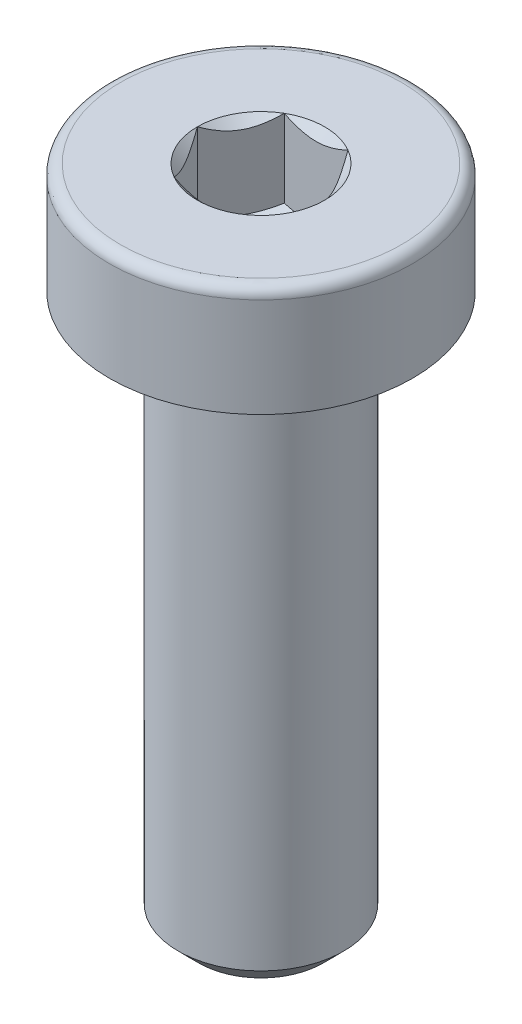
ISO-10303-21;
HEADER;
FILE_DESCRIPTION(('STEP AP214'),'2;1');
FILE_NAME('part.step','',(''),(''),'','','');
FILE_SCHEMA(('AUTOMOTIVE_DESIGN { 1 0 10303 214 1 1 1 1 }'));
ENDSEC;
DATA;
#1=APPLICATION_CONTEXT('core data for automotive mechanical design processes');
#2=APPLICATION_PROTOCOL_DEFINITION('international standard','automotive_design',2000,#1);
#3=PRODUCT_CONTEXT('',#1,'mechanical');
#4=PRODUCT('Part','Part','',(#3));
#5=PRODUCT_RELATED_PRODUCT_CATEGORY('part','',(#4));
#6=PRODUCT_DEFINITION_FORMATION('','',#4);
#7=PRODUCT_DEFINITION_CONTEXT('part definition',#1,'design');
#8=PRODUCT_DEFINITION('design','',#6,#7);
#9=PRODUCT_DEFINITION_SHAPE('','',#8);
#10=(LENGTH_UNIT() NAMED_UNIT(*) SI_UNIT(.MILLI.,.METRE.));
#11=(NAMED_UNIT(*) PLANE_ANGLE_UNIT() SI_UNIT($,.RADIAN.));
#12=(NAMED_UNIT(*) SI_UNIT($,.STERADIAN.) SOLID_ANGLE_UNIT());
#13=UNCERTAINTY_MEASURE_WITH_UNIT(LENGTH_MEASURE(1.E-05),#10,'distance_accuracy_value','');
#14=(GEOMETRIC_REPRESENTATION_CONTEXT(3) GLOBAL_UNCERTAINTY_ASSIGNED_CONTEXT((#13)) GLOBAL_UNIT_ASSIGNED_CONTEXT((#10,
#11,#12)) REPRESENTATION_CONTEXT('',''));
#15=CARTESIAN_POINT('',(0.,0.,0.));
#16=DIRECTION('',(0.,0.,1.));
#17=DIRECTION('',(1.,0.,0.));
#18=AXIS2_PLACEMENT_3D('',#15,#16,#17);
#19=CARTESIAN_POINT('',(0.,-0.2,0.));
#20=DIRECTION('',(0.,1.,0.));
#21=DIRECTION('',(0.,0.,-1.));
#22=AXIS2_PLACEMENT_3D('',#19,#20,#21);
#23=TOROIDAL_SURFACE('',#22,1.7,0.2);
#24=CARTESIAN_POINT('',(0.,0.,0.));
#25=DIRECTION('',(0.,-1.,0.));
#26=DIRECTION('',(0.,0.,-1.));
#27=AXIS2_PLACEMENT_3D('',#24,#25,#26);
#28=CIRCLE('',#27,1.7);
#29=CARTESIAN_POINT('',(0.,0.,-1.7));
#30=VERTEX_POINT('',#29);
#31=EDGE_CURVE('E169',#30,#30,#28,.T.);
#32=ORIENTED_EDGE('',*,*,#31,.T.);
#33=EDGE_LOOP('',(#32));
#34=FACE_BOUND('',#33,.T.);
#35=CARTESIAN_POINT('',(0.,-0.2,0.));
#36=DIRECTION('',(0.,1.,0.));
#37=DIRECTION('',(0.,0.,-1.));
#38=AXIS2_PLACEMENT_3D('',#35,#36,#37);
#39=CIRCLE('',#38,1.5);
#40=CARTESIAN_POINT('',(0.,-0.2,-1.5));
#41=VERTEX_POINT('',#40);
#42=EDGE_CURVE('E469',#41,#41,#39,.T.);
#43=ORIENTED_EDGE('',*,*,#42,.T.);
#44=EDGE_LOOP('',(#43));
#45=FACE_BOUND('',#44,.T.);
#46=ADVANCED_FACE('F41',(#34,#45),#23,.F.);
#47=CARTESIAN_POINT('',(0.,-10.,0.));
#48=DIRECTION('',(0.,1.,0.));
#49=DIRECTION('',(1.,0.,0.));
#50=AXIS2_PLACEMENT_3D('',#47,#48,#49);
#51=PLANE('',#50);
#52=CARTESIAN_POINT('',(0.,-10.,0.));
#53=DIRECTION('',(0.,1.,0.));
#54=DIRECTION('',(0.,0.,-1.));
#55=AXIS2_PLACEMENT_3D('',#52,#53,#54);
#56=CIRCLE('',#55,1.125);
#57=CARTESIAN_POINT('',(0.,-10.,-1.125));
#58=VERTEX_POINT('',#57);
#59=EDGE_CURVE('E11',#58,#58,#56,.T.);
#60=ORIENTED_EDGE('',*,*,#59,.F.);
#61=EDGE_LOOP('',(#60));
#62=FACE_BOUND('',#61,.T.);
#63=ADVANCED_FACE('F487',(#62),#51,.F.);
#64=CARTESIAN_POINT('',(0.,-10.125,0.));
#65=DIRECTION('',(0.,1.,0.));
#66=DIRECTION('',(-1.,0.,0.));
#67=AXIS2_PLACEMENT_3D('',#64,#65,#66);
#68=CONICAL_SURFACE('',#67,1.,0.785398163397448);
#69=ORIENTED_EDGE('',*,*,#59,.T.);
#70=EDGE_LOOP('',(#69));
#71=FACE_BOUND('',#70,.T.);
#72=CARTESIAN_POINT('',(0.,-9.625,0.));
#73=DIRECTION('',(0.,1.,0.));
#74=DIRECTION('',(-1.,0.,0.));
#75=AXIS2_PLACEMENT_3D('',#72,#73,#74);
#76=CIRCLE('',#75,1.5);
#77=CARTESIAN_POINT('',(-1.5,-9.625,0.));
#78=VERTEX_POINT('',#77);
#79=EDGE_CURVE('E328',#78,#78,#76,.T.);
#80=ORIENTED_EDGE('',*,*,#79,.F.);
#81=EDGE_LOOP('',(#80));
#82=FACE_BOUND('',#81,.T.);
#83=ADVANCED_FACE('F438',(#71,#82),#68,.T.);
#84=CARTESIAN_POINT('',(-1.15470053837925,0.5,0.));
#85=DIRECTION('',(-0.866025403784439,0.,-0.5));
#86=DIRECTION('',(0.,1.,0.));
#87=AXIS2_PLACEMENT_3D('',#84,#85,#86);
#88=PLANE('',#87);
#89=CARTESIAN_POINT('',(-1.15470053837925,2.,0.));
#90=CARTESIAN_POINT('',(-1.13811290051949,1.98342266199646,-0.0287348170953944));
#91=CARTESIAN_POINT('',(-1.12123555069305,1.96760439479917,-0.0577616138982867));
#92=CARTESIAN_POINT('',(-1.09593470093621,1.94579754194468,-0.101183953998303));
#93=CARTESIAN_POINT('',(-1.08770744910027,1.93899563963594,-0.115289976780325));
#94=CARTESIAN_POINT('',(-1.07137905760404,1.92611876946348,-0.143289328742409));
#95=CARTESIAN_POINT('',(-1.06328091933733,1.92002869586461,-0.157177412131507));
#96=CARTESIAN_POINT('',(-1.04720018701061,1.90857633773861,-0.184787164277924));
#97=CARTESIAN_POINT('',(-1.03921987610035,1.90319950581573,-0.198504111998951));
#98=CARTESIAN_POINT('',(-1.02335869013404,1.89317259824657,-0.225819419170297));
#99=CARTESIAN_POINT('',(-1.01547945146266,1.88850921181502,-0.239413822772958));
#100=CARTESIAN_POINT('',(-0.999798885932428,1.87990783588392,-0.266532275213475));
#101=CARTESIAN_POINT('',(-0.991998636338617,1.87595850190746,-0.280053335251351));
#102=CARTESIAN_POINT('',(-0.976448412405247,1.86878294697385,-0.307073372510779));
#103=CARTESIAN_POINT('',(-0.968699070566479,1.86554812543175,-0.320570421372709));
#104=CARTESIAN_POINT('',(-0.953216804871379,1.85979880306902,-0.347590357134202));
#105=CARTESIAN_POINT('',(-0.945484180860458,1.85727916970106,-0.361112320660297));
#106=CARTESIAN_POINT('',(-0.929993904585942,1.85295579242638,-0.388228510454098));
#107=CARTESIAN_POINT('',(-0.922236308144873,1.85115096744245,-0.401822595841889));
#108=CARTESIAN_POINT('',(-0.90665050966111,1.8482557150365,-0.429129644754855));
#109=CARTESIAN_POINT('',(-0.898822146976691,1.84716860492423,-0.442842867527506));
#110=CARTESIAN_POINT('',(-0.883030995902152,1.8456940799998,-0.470425755688464));
#111=CARTESIAN_POINT('',(-0.875067667178854,1.84531431420474,-0.484295517782133));
#112=CARTESIAN_POINT('',(-0.858942744760318,1.84528887087763,-0.51231125005588));
#113=CARTESIAN_POINT('',(-0.85078050857397,1.84565882739202,-0.52645688326507));
#114=CARTESIAN_POINT('',(-0.834496812685205,1.847210942197,-0.554713266474792));
#115=CARTESIAN_POINT('',(-0.826375327173013,1.84839249628394,-0.56882403459356));
#116=CARTESIAN_POINT('',(-0.810129363846157,1.85155142789717,-0.597074648783628));
#117=CARTESIAN_POINT('',(-0.802005196148906,1.85353382402747,-0.61121410805965));
#118=CARTESIAN_POINT('',(-0.785713974285288,1.85829144566636,-0.639587165283902));
#119=CARTESIAN_POINT('',(-0.777547766927851,1.86107677968836,-0.653819546505297));
#120=CARTESIAN_POINT('',(-0.761124224940597,1.86743549154836,-0.682436198086551));
#121=CARTESIAN_POINT('',(-0.752868210738168,1.87102315380283,-0.696818032238172));
#122=CARTESIAN_POINT('',(-0.736207806345465,1.87897968869029,-0.725784259598186));
#123=CARTESIAN_POINT('',(-0.727804874211313,1.88336586622526,-0.740364713591029));
#124=CARTESIAN_POINT('',(-0.711592080268563,1.8924866846744,-0.768416307208119));
#125=CARTESIAN_POINT('',(-0.703778742074904,1.89718094197276,-0.781898624581838));
#126=CARTESIAN_POINT('',(-0.688135072813054,1.90717702575227,-0.808872655482011));
#127=CARTESIAN_POINT('',(-0.680305730171417,1.91248565807263,-0.822362416598757));
#128=CARTESIAN_POINT('',(-0.664615689697741,1.92370585705,-0.84938935749767));
#129=CARTESIAN_POINT('',(-0.656756414542127,1.92962555083964,-0.862923982797114));
#130=CARTESIAN_POINT('',(-0.64099605532617,1.94206708289181,-0.890075839755966));
#131=CARTESIAN_POINT('',(-0.633096875640915,1.94859801630983,-0.903689987556145));
#132=CARTESIAN_POINT('',(-0.609052537896968,1.96932150291984,-0.945159941867087));
#133=CARTESIAN_POINT('',(-0.593083085982219,1.98426742536512,-0.972744659363466));
#134=CARTESIAN_POINT('',(-0.577350269189265,1.9999999999997,-0.999999999999873));
#135=B_SPLINE_CURVE_WITH_KNOTS('',3,(#89,#90,#91,#92,#93,#94,#95,#96,#97,#98,#99,#100,#101,#102,
#103,#104,#105,#106,#107,#108,#109,#110,#111,#112,#113,#114,#115,#116,#117,#118,#119,#120,#121,
#122,#123,#124,#125,#126,#127,#128,#129,#130,#131,#132,#133,#134),.UNSPECIFIED.,.F.,.F.,(4,2,2,
2,2,2,2,2,2,2,2,2,2,2,2,2,2,2,2,2,2,2,4),(0.,0.111272550174337,0.164335445361573,
0.215899595557141,0.266155171285321,0.315312848542686,0.363603421261408,0.411276511431237,
0.458598287135888,0.505848217490368,0.553315037999811,0.601292236029578,0.650280199235592,
0.699231732228985,0.748494907961426,0.798407597789335,0.849291872516503,0.90144968589758,
0.950262743745297,0.999680464451618,1.0498706012499,1.10098683352,1.20653128166088),.UNSPECIFIED.);
#136=CARTESIAN_POINT('',(-1.15470053837925,2.,0.));
#137=VERTEX_POINT('',#136);
#138=CARTESIAN_POINT('',(-0.577350269189626,2.,-1.));
#139=VERTEX_POINT('',#138);
#140=EDGE_CURVE('E160',#137,#139,#135,.T.);
#141=ORIENTED_EDGE('',*,*,#140,.F.);
#142=DIRECTION('',(0.,1.,0.));
#143=VECTOR('',#142,1.);
#144=CARTESIAN_POINT('',(-1.15470053837925,0.5,0.));
#145=LINE('',#144,#143);
#146=CARTESIAN_POINT('',(-1.15470053837925,0.589316397477044,0.));
#147=VERTEX_POINT('',#146);
#148=EDGE_CURVE('E54',#147,#137,#145,.T.);
#149=ORIENTED_EDGE('',*,*,#148,.F.);
#150=CARTESIAN_POINT('',(-1.15470053837925,0.589316397477044,0.));
#151=CARTESIAN_POINT('',(-0.866025403784419,0.422649730810363,-0.500000000000031));
#152=CARTESIAN_POINT('',(-0.577350269189623,0.589316397477023,-1.));
#153=B_SPLINE_CURVE_WITH_KNOTS('',2,(#150,#151,#152),.UNSPECIFIED.,.F.,.F.,(3,3),(0.,1.),.UNSPECIFIED.);
#154=CARTESIAN_POINT('',(-0.577350269189626,0.589316397477042,-1.));
#155=VERTEX_POINT('',#154);
#156=EDGE_CURVE('E163',#147,#155,#153,.T.);
#157=ORIENTED_EDGE('',*,*,#156,.T.);
#158=DIRECTION('',(0.,1.,0.));
#159=VECTOR('',#158,1.);
#160=CARTESIAN_POINT('',(-0.577350269189626,0.5,-1.));
#161=LINE('',#160,#159);
#162=EDGE_CURVE('E148',#155,#139,#161,.T.);
#163=ORIENTED_EDGE('',*,*,#162,.T.);
#164=EDGE_LOOP('',(#141,#149,#157,#163));
#165=FACE_BOUND('',#164,.T.);
#166=ADVANCED_FACE('F158',(#165),#88,.F.);
#167=CARTESIAN_POINT('',(-0.577350269189624,0.5,1.));
#168=DIRECTION('',(-0.866025403784438,0.,0.5));
#169=DIRECTION('',(-0.5,0.,-0.866025403784438));
#170=AXIS2_PLACEMENT_3D('',#167,#168,#169);
#171=PLANE('',#170);
#172=CARTESIAN_POINT('',(-0.577350269189628,2.00000000000001,1.));
#173=CARTESIAN_POINT('',(-0.593941531837459,1.98342266199647,0.971267275676974));
#174=CARTESIAN_POINT('',(-0.61064080034603,1.96760439479918,0.942137663577272));
#175=CARTESIAN_POINT('',(-0.635595225085994,1.94579754194469,0.898515314900514));
#176=CARTESIAN_POINT('',(-0.643697773243615,1.93899563963595,0.884337294416245));
#177=CARTESIAN_POINT('',(-0.659781727584165,1.92611876946349,0.856196816596529));
#178=CARTESIAN_POINT('',(-0.667760091475645,1.92002869586462,0.842239581439652));
#179=CARTESIAN_POINT('',(-0.683630472063271,1.90857633773862,0.814508382660042));
#180=CARTESIAN_POINT('',(-0.691519541796937,1.90319950581574,0.800738756821153));
#181=CARTESIAN_POINT('',(-0.70724469873634,1.89317259824658,0.773344913254501));
#182=CARTESIAN_POINT('',(-0.715078178269854,1.88850921181503,0.759724090601278));
#183=CARTESIAN_POINT('',(-0.730723164229545,1.87990783588393,0.732585096286131));
#184=CARTESIAN_POINT('',(-0.738532620911535,1.87595850190747,0.719069351963093));
#185=CARTESIAN_POINT('',(-0.754157547622717,1.86878294697386,0.692092444372544));
#186=CARTESIAN_POINT('',(-0.761971663893885,1.86554812543175,0.678632793046597));
#187=CARTESIAN_POINT('',(-0.77763048182441,1.85979880306903,0.651714789765753));
#188=CARTESIAN_POINT('',(-0.785474533741595,1.85727916970106,0.638257159171334));
#189=CARTESIAN_POINT('',(-0.80121270481961,1.85295579242638,0.611284091509063));
#190=CARTESIAN_POINT('',(-0.809106729886117,1.85115096744246,0.597768773224894));
#191=CARTESIAN_POINT('',(-0.824962428705249,1.84825571503651,0.570617551343206));
#192=CARTESIAN_POINT('',(-0.83292424665191,1.84716860492424,0.556981379002135));
#193=CARTESIAN_POINT('',(-0.848916152971775,1.84569407999981,0.529514396936106));
#194=CARTESIAN_POINT('',(-0.856946054927689,1.84531431420475,0.515683070916208));
#195=CARTESIAN_POINT('',(-0.873145929573069,1.84528887087764,0.487710612330905));
#196=CARTESIAN_POINT('',(-0.881315289191631,1.84565882739203,0.47356909183732));
#197=CARTESIAN_POINT('',(-0.897644186925879,1.84721094219701,0.445338805925414));
#198=CARTESIAN_POINT('',(-0.90580372782753,1.84839249628395,0.431250009096055));
#199=CARTESIAN_POINT('',(-0.922146495725198,1.85155142789717,0.403055285051083));
#200=CARTESIAN_POINT('',(-0.930329542805383,1.85353382402748,0.388949819802669));
#201=CARTESIAN_POINT('',(-0.946755720212819,1.85829144566637,0.360654679197969));
#202=CARTESIAN_POINT('',(-0.954998220228186,1.86107677968837,0.346466345563147));
#203=CARTESIAN_POINT('',(-0.971569196475207,1.86743549154837,0.31793481519138));
#204=CARTESIAN_POINT('',(-0.979896223102333,1.87102315380284,0.303593980082215));
#205=CARTESIAN_POINT('',(-0.996651509651594,1.8789796886903,0.274682532960673));
#206=CARTESIAN_POINT('',(-1.00507708714105,1.88336586622527,0.260115153269712));
#207=CARTESIAN_POINT('',(-1.02126408285868,1.89248668467436,0.232048665040395));
#208=CARTESIAN_POINT('',(-1.02903344310931,1.89718094197267,0.218540956989525));
#209=CARTESIAN_POINT('',(-1.04457180448032,1.90717702575211,0.191506126550374));
#210=CARTESIAN_POINT('',(-1.05233960897755,1.91248565807245,0.177980836369454));
#211=CARTESIAN_POINT('',(-1.06790060614572,1.92370585704978,0.150879392283449));
#212=CARTESIAN_POINT('',(-1.07569229790793,1.92962555083941,0.137305747693652));
#213=CARTESIAN_POINT('',(-1.09132631618625,1.94206708289158,0.11008094776045));
#214=CARTESIAN_POINT('',(-1.09916692418947,1.94859801630961,0.0964329835838638));
#215=CARTESIAN_POINT('',(-1.12305878924465,1.9693215029197,0.0548749991248427));
#216=CARTESIAN_POINT('',(-1.13896312939544,1.98426742536505,0.0272526893338586));
#217=CARTESIAN_POINT('',(-1.15470053837896,1.99999999999971,-2.5048082669767E-13));
#218=B_SPLINE_CURVE_WITH_KNOTS('',3,(#172,#173,#174,#175,#176,#177,#178,#179,#180,#181,#182,
#183,#184,#185,#186,#187,#188,#189,#190,#191,#192,#193,#194,#195,#196,#197,#198,#199,#200,#201,
#202,#203,#204,#205,#206,#207,#208,#209,#210,#211,#212,#213,#214,#215,#216,#217),.UNSPECIFIED.,
.F.,.F.,(4,2,2,2,2,2,2,2,2,2,2,2,2,2,2,2,2,2,2,2,2,2,4),(0.,0.111272550174332,0.164335445361567,
0.215899595557133,0.266155171285313,0.315312848542677,0.3636034212614,0.411276511431228,
0.45859828713588,0.505848217490361,0.553315037999805,0.601292236029574,0.65028019923533,
0.699231732228569,0.748494907960958,0.798407597788917,0.849291872516234,0.901449685897562,
0.950262743745008,0.999680464451159,1.04987060124937,1.10098683351952,1.20653128166087),.UNSPECIFIED.);
#219=CARTESIAN_POINT('',(-0.577350269189625,2.,1.));
#220=VERTEX_POINT('',#219);
#221=EDGE_CURVE('E342',#220,#137,#218,.T.);
#222=ORIENTED_EDGE('',*,*,#221,.F.);
#223=DIRECTION('',(0.,1.,0.));
#224=VECTOR('',#223,1.);
#225=CARTESIAN_POINT('',(-0.577350269189625,0.5,1.));
#226=LINE('',#225,#224);
#227=CARTESIAN_POINT('',(-0.577350269189625,0.589316397477047,1.));
#228=VERTEX_POINT('',#227);
#229=EDGE_CURVE('E327',#228,#220,#226,.T.);
#230=ORIENTED_EDGE('',*,*,#229,.F.);
#231=CARTESIAN_POINT('',(-0.577350269189624,0.589316397477046,1.));
#232=CARTESIAN_POINT('',(-0.866025403784455,0.422649730810367,0.499999999999969));
#233=CARTESIAN_POINT('',(-1.15470053837925,0.589316397477025,0.));
#234=B_SPLINE_CURVE_WITH_KNOTS('',2,(#231,#232,#233),.UNSPECIFIED.,.F.,.F.,(3,3),(0.,1.),.UNSPECIFIED.);
#235=EDGE_CURVE('E313',#228,#147,#234,.T.);
#236=ORIENTED_EDGE('',*,*,#235,.T.);
#237=ORIENTED_EDGE('',*,*,#148,.T.);
#238=EDGE_LOOP('',(#222,#230,#236,#237));
#239=FACE_BOUND('',#238,.T.);
#240=ADVANCED_FACE('F325',(#239),#171,.F.);
#241=CARTESIAN_POINT('',(0.577350269189628,0.5,1.));
#242=DIRECTION('',(0.,0.,1.));
#243=DIRECTION('',(0.,-1.,0.));
#244=AXIS2_PLACEMENT_3D('',#241,#242,#243);
#245=PLANE('',#244);
#246=CARTESIAN_POINT('',(0.577350269189624,2.00000000000001,1.));
#247=CARTESIAN_POINT('',(0.553800025915533,1.98822603681754,0.999998167957607));
#248=CARTESIAN_POINT('',(0.53002319662689,1.97688905054343,1.00001417378921));
#249=CARTESIAN_POINT('',(0.482781582166339,1.9556075877741,1.00006888120379));
#250=CARTESIAN_POINT('',(0.459331734859619,1.94562984801314,1.00010682894213));
#251=CARTESIAN_POINT('',(0.412637184989049,1.92706153398431,1.00019267101419));
#252=CARTESIAN_POINT('',(0.389404800641485,1.91844018503403,1.00024026062339));
#253=CARTESIAN_POINT('',(0.343025384343104,1.90258770334269,1.00032811834732));
#254=CARTESIAN_POINT('',(0.319887287423713,1.89533063168831,1.0003685220543));
#255=CARTESIAN_POINT('',(0.28396905815587,1.88513189438625,1.00037952108944));
#256=CARTESIAN_POINT('',(0.271315561221434,1.88173971858613,1.00037366472534));
#257=CARTESIAN_POINT('',(0.246157653172697,1.87541237483904,1.00034209137255));
#258=CARTESIAN_POINT('',(0.233655177580738,1.87246955581885,1.00031676570706));
#259=CARTESIAN_POINT('',(0.208770103174207,1.86704337026022,1.00026027717205));
#260=CARTESIAN_POINT('',(0.196389006729885,1.86455313042386,1.0002292192388));
#261=CARTESIAN_POINT('',(0.171716988877537,1.86003037325887,1.00016856051116));
#262=CARTESIAN_POINT('',(0.159427126425281,1.85799209889465,1.00013894565578));
#263=CARTESIAN_POINT('',(0.134906807402543,1.85437228307887,1.00008682181391));
#264=CARTESIAN_POINT('',(0.122677002769373,1.85278634040735,1.00006424413959));
#265=CARTESIAN_POINT('',(0.0982452716357383,1.85006970506283,1.00002877386777));
#266=CARTESIAN_POINT('',(0.0860436599187247,1.84893619003586,1.00001582077837));
#267=CARTESIAN_POINT('',(0.0616361034369748,1.84712271030556,0.999999281194874));
#268=CARTESIAN_POINT('',(0.049430239160526,1.84644166498135,0.99999567232403));
#269=CARTESIAN_POINT('',(0.0249814925742225,1.84553156126019,0.999994826477444));
#270=CARTESIAN_POINT('',(0.0127385824285995,1.84530325235072,0.999997600051223));
#271=CARTESIAN_POINT('',(-0.0117699093089312,1.84529590976491,1.00000240436833));
#272=CARTESIAN_POINT('',(-0.0240354911326579,1.84551770421206,1.00000443373431));
#273=CARTESIAN_POINT('',(-0.0485276608234832,1.84641485939752,1.00001329857417));
#274=CARTESIAN_POINT('',(-0.0607542789969373,1.84708939120195,1.00002012526552));
#275=CARTESIAN_POINT('',(-0.0852014626157827,1.84889040013758,1.00004221085803));
#276=CARTESIAN_POINT('',(-0.0974219540555072,1.8500178795742,1.00005748848831));
#277=CARTESIAN_POINT('',(-0.121889608631145,1.8527228717761,1.00009680071916));
#278=CARTESIAN_POINT('',(-0.13413646702124,1.85430313264586,1.00012088904999));
#279=CARTESIAN_POINT('',(-0.158689106182079,1.85791203563793,1.00017544918413));
#280=CARTESIAN_POINT('',(-0.170994247777745,1.85994501185442,1.00020598253097));
#281=CARTESIAN_POINT('',(-0.195695079239052,1.864457628014,1.00026809188207));
#282=CARTESIAN_POINT('',(-0.208089724420771,1.86694296685528,1.00029967641919));
#283=CARTESIAN_POINT('',(-0.233000226311658,1.87235971612185,1.00035691387752));
#284=CARTESIAN_POINT('',(-0.24551459573445,1.87529795011875,1.00038245763407));
#285=CARTESIAN_POINT('',(-0.270694579941495,1.88161679535159,1.00041468917582));
#286=CARTESIAN_POINT('',(-0.283358271723342,1.88500502464959,1.00042099293427));
#287=CARTESIAN_POINT('',(-0.319355980941363,1.89520675220563,1.00040981931455));
#288=CARTESIAN_POINT('',(-0.342562828838121,1.9024735224621,1.00036742345573));
#289=CARTESIAN_POINT('',(-0.389067231423858,1.91834639861325,1.00027227006806));
#290=CARTESIAN_POINT('',(-0.412356054143943,1.92697788991275,1.00021930978689));
#291=CARTESIAN_POINT('',(-0.459150817788463,1.94556797492265,1.00012281198921));
#292=CARTESIAN_POINT('',(-0.482644619058579,1.95555692973842,1.00007957938085));
#293=CARTESIAN_POINT('',(-0.529961603825126,1.97686192522768,1.00001682251946));
#294=CARTESIAN_POINT('',(-0.553769993135023,1.98821092489576,0.999998129439885));
#295=CARTESIAN_POINT('',(-0.577350269189629,2.,0.99999999999999));
#296=B_SPLINE_CURVE_WITH_KNOTS('',3,(#246,#247,#248,#249,#250,#251,#252,#253,#254,#255,#256,
#257,#258,#259,#260,#261,#262,#263,#264,#265,#266,#267,#268,#269,#270,#271,#272,#273,#274,#275,
#276,#277,#278,#279,#280,#281,#282,#283,#284,#285,#286,#287,#288,#289,#290,#291,#292,#293,#294,
#295),.UNSPECIFIED.,.F.,.F.,(4,2,2,2,2,2,2,2,2,2,2,2,2,2,2,2,2,2,2,2,2,2,2,2,4),(0.,
0.0789945069839851,0.155423933765288,0.229735714121901,0.302447276968801,0.341742966594387,
0.380268841749468,0.418149076076723,0.455514857491566,0.492503591404803,0.52925783231042,
0.565923975475662,0.602650767505618,0.639445192650885,0.676172432608918,0.712981396109526,
0.75001867970216,0.787427074463517,0.825344251186806,0.863901683628061,0.903223842479998,
0.976140734734358,1.05062170245461,1.12718543062468,1.20628071173709),.UNSPECIFIED.);
#297=CARTESIAN_POINT('',(0.577350269189628,2.,1.));
#298=VERTEX_POINT('',#297);
#299=EDGE_CURVE('E343',#298,#220,#296,.T.);
#300=ORIENTED_EDGE('',*,*,#299,.F.);
#301=DIRECTION('',(0.,1.,0.));
#302=VECTOR('',#301,1.);
#303=CARTESIAN_POINT('',(0.577350269189628,0.5,1.));
#304=LINE('',#303,#302);
#305=CARTESIAN_POINT('',(0.577350269189628,0.589316397477047,1.));
#306=VERTEX_POINT('',#305);
#307=EDGE_CURVE('E214',#306,#298,#304,.T.);
#308=ORIENTED_EDGE('',*,*,#307,.F.);
#309=CARTESIAN_POINT('',(0.577350269189629,0.589316397477046,1.));
#310=CARTESIAN_POINT('',(0.,0.422649730810369,1.));
#311=CARTESIAN_POINT('',(-0.577350269189626,0.589316397477027,1.));
#312=B_SPLINE_CURVE_WITH_KNOTS('',2,(#309,#310,#311),.UNSPECIFIED.,.F.,.F.,(3,3),(0.,1.),.UNSPECIFIED.);
#313=EDGE_CURVE('E153',#306,#228,#312,.T.);
#314=ORIENTED_EDGE('',*,*,#313,.T.);
#315=ORIENTED_EDGE('',*,*,#229,.T.);
#316=EDGE_LOOP('',(#300,#308,#314,#315));
#317=FACE_BOUND('',#316,.T.);
#318=ADVANCED_FACE('F239',(#317),#245,.F.);
#319=CARTESIAN_POINT('',(1.15470053837925,0.5,0.));
#320=DIRECTION('',(0.866025403784439,0.,0.5));
#321=DIRECTION('',(0.,-1.,0.));
#322=AXIS2_PLACEMENT_3D('',#319,#320,#321);
#323=PLANE('',#322);
#324=CARTESIAN_POINT('',(1.15470053837925,2.,0.));
#325=CARTESIAN_POINT('',(1.13811290051954,1.98342266199651,0.0287348170953168));
#326=CARTESIAN_POINT('',(1.12123555069315,1.96760439479927,0.0577616138981319));
#327=CARTESIAN_POINT('',(1.0959347009364,1.94579754194485,0.101183953998051));
#328=CARTESIAN_POINT('',(1.08770744910049,1.93899563963613,0.11528997678005));
#329=CARTESIAN_POINT('',(1.0713790576043,1.9261187694637,0.1432893287421));
#330=CARTESIAN_POINT('',(1.06328091933761,1.92002869586484,0.157177412131185));
#331=CARTESIAN_POINT('',(1.04720018701092,1.90857633773886,0.184787164277586));
#332=CARTESIAN_POINT('',(1.03921987610068,1.90319950581599,0.198504111998609));
#333=CARTESIAN_POINT('',(1.02335869013438,1.89317259824684,0.225819419169955));
#334=CARTESIAN_POINT('',(1.01547945146302,1.8885092118153,0.239413822772619));
#335=CARTESIAN_POINT('',(0.999798885932792,1.87990783588419,0.26653227521315));
#336=CARTESIAN_POINT('',(0.991998636338982,1.87595850190773,0.280053335251036));
#337=CARTESIAN_POINT('',(0.976448412405607,1.86878294697411,0.307073372510489));
#338=CARTESIAN_POINT('',(0.968699070566833,1.865548125432,0.320570421372434));
#339=CARTESIAN_POINT('',(0.953216804871711,1.85979880306925,0.34759035713396));
#340=CARTESIAN_POINT('',(0.945484180860775,1.85727916970128,0.361112320660075));
#341=CARTESIAN_POINT('',(0.929993904586221,1.85295579242657,0.388228510453917));
#342=CARTESIAN_POINT('',(0.922236308145128,1.85115096744263,0.401822595841729));
#343=CARTESIAN_POINT('',(0.90665050966131,1.84825571503663,0.429129644754741));
#344=CARTESIAN_POINT('',(0.898822146976858,1.84716860492434,0.442842867527415));
#345=CARTESIAN_POINT('',(0.883030995902241,1.84569407999986,0.470425755688419));
#346=CARTESIAN_POINT('',(0.875067667178897,1.84531431420477,0.48429551778211));
#347=CARTESIAN_POINT('',(0.858942744760382,1.84528887087762,0.512311250055722));
#348=CARTESIAN_POINT('',(0.850780508574103,1.84565882739198,0.526456883264756));
#349=CARTESIAN_POINT('',(0.834496812685462,1.84721094219691,0.554713266474235));
#350=CARTESIAN_POINT('',(0.826375327173327,1.84839249628385,0.568824034592915));
#351=CARTESIAN_POINT('',(0.810129363846558,1.85155142789705,0.597074648782873));
#352=CARTESIAN_POINT('',(0.802005196149339,1.85353382402735,0.611214108058871));
#353=CARTESIAN_POINT('',(0.785713974285749,1.85829144566624,0.639587165283134));
#354=CARTESIAN_POINT('',(0.777547766928309,1.86107677968825,0.653819546504565));
#355=CARTESIAN_POINT('',(0.761124224941007,1.86743549154827,0.682436198085945));
#356=CARTESIAN_POINT('',(0.752868210738532,1.87102315380276,0.696818032237658));
#357=CARTESIAN_POINT('',(0.73620780634568,1.87897968869026,0.725784259597905));
#358=CARTESIAN_POINT('',(0.727804874211422,1.88336586622525,0.74036471359089));
#359=CARTESIAN_POINT('',(0.711592080268588,1.89248668467437,0.768416307208036));
#360=CARTESIAN_POINT('',(0.703778742074949,1.89718094197268,0.781898624581674));
#361=CARTESIAN_POINT('',(0.688135072813142,1.90717702575212,0.808872655481718));
#362=CARTESIAN_POINT('',(0.680305730171529,1.91248565807245,0.822362416598417));
#363=CARTESIAN_POINT('',(0.664615689697889,1.92370585704979,0.849389357497269));
#364=CARTESIAN_POINT('',(0.656756414542289,1.92962555083942,0.862923982796697));
#365=CARTESIAN_POINT('',(0.640996055326348,1.94206708289159,0.890075839755551));
#366=CARTESIAN_POINT('',(0.633096875641094,1.94859801630962,0.903689987555748));
#367=CARTESIAN_POINT('',(0.609052537897095,1.96932150291971,0.945159941866839));
#368=CARTESIAN_POINT('',(0.593083085982296,1.98426742536507,0.972744659363348));
#369=CARTESIAN_POINT('',(0.577350269189271,1.99999999999972,0.999999999999876));
#370=B_SPLINE_CURVE_WITH_KNOTS('',3,(#324,#325,#326,#327,#328,#329,#330,#331,#332,#333,#334,
#335,#336,#337,#338,#339,#340,#341,#342,#343,#344,#345,#346,#347,#348,#349,#350,#351,#352,#353,
#354,#355,#356,#357,#358,#359,#360,#361,#362,#363,#364,#365,#366,#367,#368,#369),.UNSPECIFIED.,
.F.,.F.,(4,2,2,2,2,2,2,2,2,2,2,2,2,2,2,2,2,2,2,2,2,2,4),(0.,0.111272550174011,0.16433544536114,
0.215899595556638,0.266155171284781,0.315312848542141,0.363603421260888,0.411276511430768,
0.458598287135496,0.505848217490074,0.553315037999631,0.601292236029526,0.650280199235029,
0.699231732228109,0.74849490796044,0.798407597788447,0.849291872515925,0.901449685897527,
0.950262743744969,0.999680464451117,1.04987060124933,1.10098683351948,1.20653128166083),.UNSPECIFIED.);
#371=CARTESIAN_POINT('',(1.15470053837925,2.,0.));
#372=VERTEX_POINT('',#371);
#373=EDGE_CURVE('E219',#372,#298,#370,.T.);
#374=ORIENTED_EDGE('',*,*,#373,.F.);
#375=DIRECTION('',(0.,1.,0.));
#376=VECTOR('',#375,1.);
#377=CARTESIAN_POINT('',(1.15470053837925,0.5,0.));
#378=LINE('',#377,#376);
#379=CARTESIAN_POINT('',(1.15470053837925,0.589316397477045,0.));
#380=VERTEX_POINT('',#379);
#381=EDGE_CURVE('E165',#380,#372,#378,.T.);
#382=ORIENTED_EDGE('',*,*,#381,.F.);
#383=CARTESIAN_POINT('',(1.15470053837925,0.589316397477044,0.));
#384=CARTESIAN_POINT('',(0.866025403784422,0.422649730810369,0.500000000000028));
#385=CARTESIAN_POINT('',(0.577350269189625,0.589316397477027,1.));
#386=B_SPLINE_CURVE_WITH_KNOTS('',2,(#383,#384,#385),.UNSPECIFIED.,.F.,.F.,(3,3),(0.,1.),.UNSPECIFIED.);
#387=EDGE_CURVE('E114',#380,#306,#386,.T.);
#388=ORIENTED_EDGE('',*,*,#387,.T.);
#389=ORIENTED_EDGE('',*,*,#307,.T.);
#390=EDGE_LOOP('',(#374,#382,#388,#389));
#391=FACE_BOUND('',#390,.T.);
#392=ADVANCED_FACE('F238',(#391),#323,.F.);
#393=CARTESIAN_POINT('',(0.577350269189626,0.5,-1.));
#394=DIRECTION('',(0.866025403784439,0.,-0.5));
#395=DIRECTION('',(0.,-1.,0.));
#396=AXIS2_PLACEMENT_3D('',#393,#394,#395);
#397=PLANE('',#396);
#398=CARTESIAN_POINT('',(0.577350269189624,1.99999999999999,-0.999999999999998));
#399=CARTESIAN_POINT('',(0.593941531837408,1.9834226619965,-0.971267275677055));
#400=CARTESIAN_POINT('',(0.610640800345942,1.96760439479926,-0.94213766357744));
#401=CARTESIAN_POINT('',(0.635595225085866,1.94579754194484,-0.898515314900803));
#402=CARTESIAN_POINT('',(0.64369777324348,1.93899563963612,-0.884337294416566));
#403=CARTESIAN_POINT('',(0.659781727584023,1.92611876946369,-0.856196816596903));
#404=CARTESIAN_POINT('',(0.667760091475502,1.92002869586483,-0.842239581440049));
#405=CARTESIAN_POINT('',(0.683630472063132,1.90857633773885,-0.814508382660476));
#406=CARTESIAN_POINT('',(0.691519541796802,1.90319950581598,-0.800738756821601));
#407=CARTESIAN_POINT('',(0.707244698736216,1.89317259824683,-0.773344913254968));
#408=CARTESIAN_POINT('',(0.715078178269738,1.88850921181529,-0.75972409060175));
#409=CARTESIAN_POINT('',(0.730723164229445,1.87990783588418,-0.732585096286604));
#410=CARTESIAN_POINT('',(0.738532620911444,1.87595850190772,-0.719069351963562));
#411=CARTESIAN_POINT('',(0.754157547622645,1.8687829469741,-0.692092444372996));
#412=CARTESIAN_POINT('',(0.761971663893822,1.86554812543199,-0.678632793047035));
#413=CARTESIAN_POINT('',(0.777630481824367,1.85979880306924,-0.651714789766157));
#414=CARTESIAN_POINT('',(0.785474533741561,1.85727916970127,-0.638257159171715));
#415=CARTESIAN_POINT('',(0.801212704819592,1.85295579242656,-0.611284091509391));
#416=CARTESIAN_POINT('',(0.809106729886106,1.85115096744262,-0.59776877322519));
#417=CARTESIAN_POINT('',(0.824962428705249,1.84825571503662,-0.570617551343432));
#418=CARTESIAN_POINT('',(0.832924246651914,1.84716860492433,-0.556981379002321));
#419=CARTESIAN_POINT('',(0.848916152971781,1.84569407999985,-0.529514396936204));
#420=CARTESIAN_POINT('',(0.856946054927693,1.84531431420477,-0.515683070916256));
#421=CARTESIAN_POINT('',(0.873145929573076,1.8452888708776,-0.487710612330836));
#422=CARTESIAN_POINT('',(0.881315289191643,1.84565882739196,-0.473569091837184));
#423=CARTESIAN_POINT('',(0.897644186925894,1.8472109421969,-0.445338805925169));
#424=CARTESIAN_POINT('',(0.905803727827543,1.84839249628383,-0.431250009095768));
#425=CARTESIAN_POINT('',(0.922146495725204,1.85155142789704,-0.403055285050741));
#426=CARTESIAN_POINT('',(0.930329542805384,1.85353382402733,-0.388949819802311));
#427=CARTESIAN_POINT('',(0.946755720212809,1.85829144566623,-0.360654679197609));
#428=CARTESIAN_POINT('',(0.954998220228171,1.86107677968823,-0.3464663455628));
#429=CARTESIAN_POINT('',(0.971569196475185,1.86743549154826,-0.317934815191085));
#430=CARTESIAN_POINT('',(0.979896223102309,1.87102315380274,-0.303593980081958));
#431=CARTESIAN_POINT('',(0.996651509651577,1.87897968869024,-0.274682532960527));
#432=CARTESIAN_POINT('',(1.00507708714105,1.88336586622524,-0.260115153269637));
#433=CARTESIAN_POINT('',(1.02126408285878,1.89248668467443,-0.232048665040293));
#434=CARTESIAN_POINT('',(1.02903344310952,1.89718094197282,-0.218540956989325));
#435=CARTESIAN_POINT('',(1.04457180448067,1.90717702575239,-0.191506126550005));
#436=CARTESIAN_POINT('',(1.05233960897795,1.91248565807276,-0.177980836369012));
#437=CARTESIAN_POINT('',(1.06790060614618,1.92370585705016,-0.150879392282903));
#438=CARTESIAN_POINT('',(1.0756922979084,1.9296255508398,-0.137305747693075));
#439=CARTESIAN_POINT('',(1.0913263161867,1.94206708289197,-0.110080947759855));
#440=CARTESIAN_POINT('',(1.0991669241899,1.94859801630999,-0.0964329835832811));
#441=CARTESIAN_POINT('',(1.12305878924491,1.96932150291994,-0.0548749991244581));
#442=CARTESIAN_POINT('',(1.13896312939556,1.98426742536517,-0.027252689333654));
#443=CARTESIAN_POINT('',(1.15470053837897,1.99999999999972,2.51310661974698E-13));
#444=B_SPLINE_CURVE_WITH_KNOTS('',3,(#398,#399,#400,#401,#402,#403,#404,#405,#406,#407,#408,
#409,#410,#411,#412,#413,#414,#415,#416,#417,#418,#419,#420,#421,#422,#423,#424,#425,#426,#427,
#428,#429,#430,#431,#432,#433,#434,#435,#436,#437,#438,#439,#440,#441,#442,#443),.UNSPECIFIED.,
.F.,.F.,(4,2,2,2,2,2,2,2,2,2,2,2,2,2,2,2,2,2,2,2,2,2,4),(0.,0.111272550174011,0.164335445361141,
0.215899595556638,0.266155171284782,0.315312848542142,0.363603421260889,0.411276511430769,
0.458598287135497,0.505848217490076,0.553315037999634,0.601292236029529,0.650280199235466,
0.699231732228805,0.748494907961222,0.798407597789143,0.849291872516367,0.901449685897551,
0.950262743745452,0.999680464451892,1.04987060125021,1.10098683352028,1.20653128166085),.UNSPECIFIED.);
#445=CARTESIAN_POINT('',(0.577350269189626,2.,-1.));
#446=VERTEX_POINT('',#445);
#447=EDGE_CURVE('E130',#446,#372,#444,.T.);
#448=ORIENTED_EDGE('',*,*,#447,.F.);
#449=DIRECTION('',(0.,1.,0.));
#450=VECTOR('',#449,1.);
#451=CARTESIAN_POINT('',(0.577350269189626,0.5,-1.));
#452=LINE('',#451,#450);
#453=CARTESIAN_POINT('',(0.577350269189626,0.589316397477042,-1.));
#454=VERTEX_POINT('',#453);
#455=EDGE_CURVE('E151',#454,#446,#452,.T.);
#456=ORIENTED_EDGE('',*,*,#455,.F.);
#457=CARTESIAN_POINT('',(0.577350269189626,0.589316397477041,-1.));
#458=CARTESIAN_POINT('',(0.866025403784456,0.422649730810364,-0.49999999999997));
#459=CARTESIAN_POINT('',(1.15470053837925,0.589316397477026,0.));
#460=B_SPLINE_CURVE_WITH_KNOTS('',2,(#457,#458,#459),.UNSPECIFIED.,.F.,.F.,(3,3),(0.,1.),.UNSPECIFIED.);
#461=EDGE_CURVE('E413',#454,#380,#460,.T.);
#462=ORIENTED_EDGE('',*,*,#461,.T.);
#463=ORIENTED_EDGE('',*,*,#381,.T.);
#464=EDGE_LOOP('',(#448,#456,#462,#463));
#465=FACE_BOUND('',#464,.T.);
#466=ADVANCED_FACE('F229',(#465),#397,.F.);
#467=CARTESIAN_POINT('',(-0.577350269189626,0.5,-1.));
#468=DIRECTION('',(0.,0.,-1.));
#469=DIRECTION('',(1.,0.,0.));
#470=AXIS2_PLACEMENT_3D('',#467,#468,#469);
#471=PLANE('',#470);
#472=CARTESIAN_POINT('',(-0.57735026918963,2.,-1.));
#473=CARTESIAN_POINT('',(-0.553799018626332,1.98822553857165,-0.999998173354036));
#474=CARTESIAN_POINT('',(-0.530021163519476,1.97688806823107,-1.00001416004713));
#475=CARTESIAN_POINT('',(-0.482777645672904,1.95560580828222,-1.00006882217097));
#476=CARTESIAN_POINT('',(-0.459326924867017,1.94562774621228,-1.00010674385478));
#477=CARTESIAN_POINT('',(-0.41263076310741,1.92705897163753,-1.00019256426333));
#478=CARTESIAN_POINT('',(-0.38939764378498,1.91843747465112,-1.00024015736838));
#479=CARTESIAN_POINT('',(-0.342950204797468,1.90256203937554,-1.00032813390887));
#480=CARTESIAN_POINT('',(-0.319743655589981,1.89528554551412,-1.00036863550711));
#481=CARTESIAN_POINT('',(-0.28379128714849,1.88508381221227,-1.0003795906038));
#482=CARTESIAN_POINT('',(-0.271173414160845,1.88170303933697,-1.00037378374481));
#483=CARTESIAN_POINT('',(-0.246085560922053,1.87539592858828,-1.00034249941035));
#484=CARTESIAN_POINT('',(-0.233617496928954,1.87246201269112,-1.00031740784827));
#485=CARTESIAN_POINT('',(-0.208764412875414,1.86704320231722,-1.00026132520407));
#486=CARTESIAN_POINT('',(-0.19638062679567,1.86455266223854,-1.00023042045424));
#487=CARTESIAN_POINT('',(-0.171702966320913,1.86002941476161,-1.00017003093781));
#488=CARTESIAN_POINT('',(-0.15941014937153,1.85799095773679,-1.00014053259975));
#489=CARTESIAN_POINT('',(-0.134883643999216,1.85437088523129,-1.00008857478594));
#490=CARTESIAN_POINT('',(-0.122650606079548,1.85278487744366,-1.00006604744148));
#491=CARTESIAN_POINT('',(-0.0982121229287101,1.85006821158009,-1.00003057238562));
#492=CARTESIAN_POINT('',(-0.0860069912288732,1.84893474144217,-1.00001756508196));
#493=CARTESIAN_POINT('',(-0.0615206333559041,1.84711617328081,-1.00000075780238));
#494=CARTESIAN_POINT('',(-0.0492392901357822,1.84643264686591,-0.999996989975494));
#495=CARTESIAN_POINT('',(-0.0246386324751404,1.84552292104013,-0.999995628044652));
#496=CARTESIAN_POINT('',(-0.012319289032145,1.84529750750861,-0.999998044533703));
#497=CARTESIAN_POINT('',(0.0121891761432831,1.84530155985422,-1.00000209957335));
#498=CARTESIAN_POINT('',(0.0243782990189907,1.845526246567,-1.00000374607075));
#499=CARTESIAN_POINT('',(0.0487185070377809,1.84642380416033,-1.00001205209129));
#500=CARTESIAN_POINT('',(0.0608696213382497,1.84709588263677,-1.00001870275395));
#501=CARTESIAN_POINT('',(0.0852380225508613,1.848891850074,-1.00004050720725));
#502=CARTESIAN_POINT('',(0.0974550405850347,1.85001938024755,-1.00005572992515));
#503=CARTESIAN_POINT('',(0.121916028787175,1.85272435329628,-1.00009503372606));
#504=CARTESIAN_POINT('',(0.13415969299641,1.85430455429515,-1.00011916938457));
#505=CARTESIAN_POINT('',(0.158706216430161,1.85791321080521,-1.00017388808731));
#506=CARTESIAN_POINT('',(0.171008435091418,1.85994600906713,-1.00020453345274));
#507=CARTESIAN_POINT('',(0.195703679393572,1.86445814400752,-1.00026690229582));
#508=CARTESIAN_POINT('',(0.20809565889068,1.86694318675753,-1.00029863477332));
#509=CARTESIAN_POINT('',(0.233038212021836,1.87236730255237,-1.00035626972392));
#510=CARTESIAN_POINT('',(0.24558702968548,1.8753144316261,-1.00038204351512));
#511=CARTESIAN_POINT('',(0.270837130755103,1.88165350290157,-1.00041455700835));
#512=CARTESIAN_POINT('',(0.283536471910628,1.88505313626283,-1.00042090732892));
#513=CARTESIAN_POINT('',(0.319499881149073,1.89525184723143,-1.00040967732382));
#514=CARTESIAN_POINT('',(0.342638089596974,1.90249917243223,-1.00036738779502));
#515=CARTESIAN_POINT('',(0.389074303524819,1.91834907543261,-1.00027237272484));
#516=CARTESIAN_POINT('',(0.412362412542345,1.92698042722443,-1.00021941755009));
#517=CARTESIAN_POINT('',(0.459155597441506,1.94557006531457,-1.00012289938572));
#518=CARTESIAN_POINT('',(0.482648537268387,1.95555870247411,-1.00007964036235));
#519=CARTESIAN_POINT('',(0.529963632723351,1.9768629062393,-1.00001683713881));
#520=CARTESIAN_POINT('',(0.553770998426698,1.9882114222119,-0.9999981241633));
#521=CARTESIAN_POINT('',(0.577350269189634,1.99999999999999,-0.99999999999999));
#522=B_SPLINE_CURVE_WITH_KNOTS('',3,(#472,#473,#474,#475,#476,#477,#478,#479,#480,#481,#482,
#483,#484,#485,#486,#487,#488,#489,#490,#491,#492,#493,#494,#495,#496,#497,#498,#499,#500,#501,
#502,#503,#504,#505,#506,#507,#508,#509,#510,#511,#512,#513,#514,#515,#516,#517,#518,#519,#520,
#521),.UNSPECIFIED.,.F.,.F.,(4,2,2,2,2,2,2,2,2,2,2,2,2,2,2,2,2,2,2,2,2,2,2,2,4),(0.,
0.0789978972695773,0.15543010410763,0.229744134366991,0.30266870017871,0.341852354194089,
0.380271674271243,0.418159989059979,0.45553460042943,0.492532973314776,0.529297720399875,
0.56619021112632,0.603145936609836,0.639711346045882,0.676212163855028,0.713010761266896,
0.750038523627865,0.787438183603003,0.825347352327571,0.86401143959863,0.903445706239183,
0.97614903621833,1.05062782272799,1.12718880955699,1.20628070690683),.UNSPECIFIED.);
#523=EDGE_CURVE('E125',#139,#446,#522,.T.);
#524=ORIENTED_EDGE('',*,*,#523,.F.);
#525=ORIENTED_EDGE('',*,*,#162,.F.);
#526=CARTESIAN_POINT('',(-0.577350269189627,0.589316397477041,-1.));
#527=CARTESIAN_POINT('',(0.,0.422649730810363,-1.));
#528=CARTESIAN_POINT('',(0.577350269189628,0.589316397477022,-1.));
#529=B_SPLINE_CURVE_WITH_KNOTS('',2,(#526,#527,#528),.UNSPECIFIED.,.F.,.F.,(3,3),(0.,1.),.UNSPECIFIED.);
#530=EDGE_CURVE('E257',#155,#454,#529,.T.);
#531=ORIENTED_EDGE('',*,*,#530,.T.);
#532=ORIENTED_EDGE('',*,*,#455,.T.);
#533=EDGE_LOOP('',(#524,#525,#531,#532));
#534=FACE_BOUND('',#533,.T.);
#535=ADVANCED_FACE('F147',(#534),#471,.F.);
#536=CARTESIAN_POINT('',(0.,2.,0.));
#537=DIRECTION('',(0.,1.,0.));
#538=DIRECTION('',(0.,0.,-1.));
#539=AXIS2_PLACEMENT_3D('',#536,#537,#538);
#540=CONICAL_SURFACE('',#539,1.15470053837925,0.785398163397448);
#541=ORIENTED_EDGE('',*,*,#140,.T.);
#542=CARTESIAN_POINT('',(0.,2.,0.));
#543=DIRECTION('',(0.,1.,0.));
#544=DIRECTION('',(-1.,0.,0.));
#545=AXIS2_PLACEMENT_3D('',#542,#543,#544);
#546=CIRCLE('',#545,1.15470053837925);
#547=EDGE_CURVE('E133',#139,#137,#546,.T.);
#548=ORIENTED_EDGE('',*,*,#547,.T.);
#549=EDGE_LOOP('',(#541,#548));
#550=FACE_BOUND('',#549,.T.);
#551=ADVANCED_FACE('F168',(#550),#540,.F.);
#552=CARTESIAN_POINT('',(0.,1.8,0.));
#553=DIRECTION('',(0.,1.,0.));
#554=DIRECTION('',(0.,0.,-1.));
#555=AXIS2_PLACEMENT_3D('',#552,#553,#554);
#556=TOROIDAL_SURFACE('',#555,2.55,0.2);
#557=CARTESIAN_POINT('',(0.,2.,0.));
#558=DIRECTION('',(0.,-1.,0.));
#559=DIRECTION('',(0.,0.,-1.));
#560=AXIS2_PLACEMENT_3D('',#557,#558,#559);
#561=CIRCLE('',#560,2.55);
#562=CARTESIAN_POINT('',(0.,2.,-2.55));
#563=VERTEX_POINT('',#562);
#564=EDGE_CURVE('E140',#563,#563,#561,.T.);
#565=ORIENTED_EDGE('',*,*,#564,.T.);
#566=EDGE_LOOP('',(#565));
#567=FACE_BOUND('',#566,.T.);
#568=CARTESIAN_POINT('',(0.,1.8,0.));
#569=DIRECTION('',(0.,1.,0.));
#570=DIRECTION('',(0.,0.,-1.));
#571=AXIS2_PLACEMENT_3D('',#568,#569,#570);
#572=CIRCLE('',#571,2.75);
#573=CARTESIAN_POINT('',(0.,1.8,-2.75));
#574=VERTEX_POINT('',#573);
#575=EDGE_CURVE('E452',#574,#574,#572,.T.);
#576=ORIENTED_EDGE('',*,*,#575,.T.);
#577=EDGE_LOOP('',(#576));
#578=FACE_BOUND('',#577,.T.);
#579=ADVANCED_FACE('F188',(#567,#578),#556,.T.);
#580=CARTESIAN_POINT('',(0.,0.,0.));
#581=DIRECTION('',(0.,1.,0.));
#582=DIRECTION('',(1.,0.,0.));
#583=AXIS2_PLACEMENT_3D('',#580,#581,#582);
#584=PLANE('',#583);
#585=CARTESIAN_POINT('',(0.,0.,0.));
#586=DIRECTION('',(0.,-1.,0.));
#587=DIRECTION('',(1.,0.,0.));
#588=AXIS2_PLACEMENT_3D('',#585,#586,#587);
#589=CIRCLE('',#588,2.75);
#590=CARTESIAN_POINT('',(2.75,0.,0.));
#591=VERTEX_POINT('',#590);
#592=EDGE_CURVE('E141',#591,#591,#589,.T.);
#593=ORIENTED_EDGE('',*,*,#592,.T.);
#594=EDGE_LOOP('',(#593));
#595=FACE_BOUND('',#594,.T.);
#596=ORIENTED_EDGE('',*,*,#31,.F.);
#597=EDGE_LOOP('',(#596));
#598=FACE_BOUND('',#597,.T.);
#599=ADVANCED_FACE('F477',(#595,#598),#584,.F.);
#600=CARTESIAN_POINT('',(0.,2.,0.));
#601=DIRECTION('',(0.,1.,0.));
#602=DIRECTION('',(1.,0.,0.));
#603=AXIS2_PLACEMENT_3D('',#600,#601,#602);
#604=PLANE('',#603);
#605=ORIENTED_EDGE('',*,*,#564,.F.);
#606=EDGE_LOOP('',(#605));
#607=FACE_BOUND('',#606,.T.);
#608=CARTESIAN_POINT('',(0.,2.,0.));
#609=DIRECTION('',(0.,1.,0.));
#610=DIRECTION('',(-1.,0.,0.));
#611=AXIS2_PLACEMENT_3D('',#608,#609,#610);
#612=CIRCLE('',#611,1.15470053837925);
#613=EDGE_CURVE('E136',#137,#220,#612,.T.);
#614=ORIENTED_EDGE('',*,*,#613,.F.);
#615=ORIENTED_EDGE('',*,*,#547,.F.);
#616=CARTESIAN_POINT('',(0.,2.,0.));
#617=DIRECTION('',(0.,1.,0.));
#618=DIRECTION('',(-1.,0.,0.));
#619=AXIS2_PLACEMENT_3D('',#616,#617,#618);
#620=CIRCLE('',#619,1.15470053837925);
#621=EDGE_CURVE('E121',#446,#139,#620,.T.);
#622=ORIENTED_EDGE('',*,*,#621,.F.);
#623=CARTESIAN_POINT('',(0.,2.,0.));
#624=DIRECTION('',(0.,1.,0.));
#625=DIRECTION('',(-1.,0.,0.));
#626=AXIS2_PLACEMENT_3D('',#623,#624,#625);
#627=CIRCLE('',#626,1.15470053837925);
#628=EDGE_CURVE('E217',#372,#446,#627,.T.);
#629=ORIENTED_EDGE('',*,*,#628,.F.);
#630=CARTESIAN_POINT('',(0.,2.,0.));
#631=DIRECTION('',(0.,1.,0.));
#632=DIRECTION('',(-1.,0.,0.));
#633=AXIS2_PLACEMENT_3D('',#630,#631,#632);
#634=CIRCLE('',#633,1.15470053837925);
#635=EDGE_CURVE('E399',#298,#372,#634,.T.);
#636=ORIENTED_EDGE('',*,*,#635,.F.);
#637=CARTESIAN_POINT('',(0.,2.,0.));
#638=DIRECTION('',(0.,1.,0.));
#639=DIRECTION('',(-1.,0.,0.));
#640=AXIS2_PLACEMENT_3D('',#637,#638,#639);
#641=CIRCLE('',#640,1.15470053837925);
#642=EDGE_CURVE('E340',#220,#298,#641,.T.);
#643=ORIENTED_EDGE('',*,*,#642,.F.);
#644=EDGE_LOOP('',(#614,#615,#622,#629,#636,#643));
#645=FACE_BOUND('',#644,.T.);
#646=ADVANCED_FACE('F134',(#607,#645),#604,.T.);
#647=CARTESIAN_POINT('',(0.,2.,0.));
#648=DIRECTION('',(0.,-1.,0.));
#649=DIRECTION('',(0.,0.,1.));
#650=AXIS2_PLACEMENT_3D('',#647,#648,#649);
#651=CYLINDRICAL_SURFACE('',#650,2.75);
#652=ORIENTED_EDGE('',*,*,#592,.F.);
#653=EDGE_LOOP('',(#652));
#654=FACE_BOUND('',#653,.T.);
#655=ORIENTED_EDGE('',*,*,#575,.F.);
#656=EDGE_LOOP('',(#655));
#657=FACE_BOUND('',#656,.T.);
#658=ADVANCED_FACE('F484',(#654,#657),#651,.T.);
#659=CARTESIAN_POINT('',(0.,2.,0.));
#660=DIRECTION('',(0.,1.,0.));
#661=DIRECTION('',(0.,0.,-1.));
#662=AXIS2_PLACEMENT_3D('',#659,#660,#661);
#663=CONICAL_SURFACE('',#662,1.15470053837925,0.785398163397448);
#664=ORIENTED_EDGE('',*,*,#221,.T.);
#665=ORIENTED_EDGE('',*,*,#613,.T.);
#666=EDGE_LOOP('',(#664,#665));
#667=FACE_BOUND('',#666,.T.);
#668=ADVANCED_FACE('F43',(#667),#663,.F.);
#669=CARTESIAN_POINT('',(0.,2.,0.));
#670=DIRECTION('',(0.,1.,0.));
#671=DIRECTION('',(0.,0.,-1.));
#672=AXIS2_PLACEMENT_3D('',#669,#670,#671);
#673=CONICAL_SURFACE('',#672,1.15470053837925,0.785398163397448);
#674=ORIENTED_EDGE('',*,*,#299,.T.);
#675=ORIENTED_EDGE('',*,*,#642,.T.);
#676=EDGE_LOOP('',(#674,#675));
#677=FACE_BOUND('',#676,.T.);
#678=ADVANCED_FACE('F196',(#677),#673,.F.);
#679=CARTESIAN_POINT('',(0.,2.,0.));
#680=DIRECTION('',(0.,1.,0.));
#681=DIRECTION('',(0.,0.,-1.));
#682=AXIS2_PLACEMENT_3D('',#679,#680,#681);
#683=CONICAL_SURFACE('',#682,1.15470053837925,0.785398163397448);
#684=ORIENTED_EDGE('',*,*,#373,.T.);
#685=ORIENTED_EDGE('',*,*,#635,.T.);
#686=EDGE_LOOP('',(#684,#685));
#687=FACE_BOUND('',#686,.T.);
#688=ADVANCED_FACE('F191',(#687),#683,.F.);
#689=CARTESIAN_POINT('',(0.,2.,0.));
#690=DIRECTION('',(0.,1.,0.));
#691=DIRECTION('',(0.,0.,-1.));
#692=AXIS2_PLACEMENT_3D('',#689,#690,#691);
#693=CONICAL_SURFACE('',#692,1.15470053837925,0.785398163397448);
#694=ORIENTED_EDGE('',*,*,#447,.T.);
#695=ORIENTED_EDGE('',*,*,#628,.T.);
#696=EDGE_LOOP('',(#694,#695));
#697=FACE_BOUND('',#696,.T.);
#698=ADVANCED_FACE('F195',(#697),#693,.F.);
#699=CARTESIAN_POINT('',(0.,2.,0.));
#700=DIRECTION('',(0.,1.,0.));
#701=DIRECTION('',(0.,0.,-1.));
#702=AXIS2_PLACEMENT_3D('',#699,#700,#701);
#703=CONICAL_SURFACE('',#702,1.15470053837925,0.785398163397448);
#704=ORIENTED_EDGE('',*,*,#523,.T.);
#705=ORIENTED_EDGE('',*,*,#621,.T.);
#706=EDGE_LOOP('',(#704,#705));
#707=FACE_BOUND('',#706,.T.);
#708=ADVANCED_FACE('F123',(#707),#703,.F.);
#709=CARTESIAN_POINT('',(0.,0.5,0.));
#710=DIRECTION('',(0.,1.,0.));
#711=DIRECTION('',(0.,0.,-1.));
#712=AXIS2_PLACEMENT_3D('',#709,#710,#711);
#713=CONICAL_SURFACE('',#712,1.,1.0471975511966);
#714=CARTESIAN_POINT('',(0.,-0.0773502691896258,0.));
#715=VERTEX_POINT('',#714);
#716=VERTEX_LOOP('',#715);
#717=FACE_BOUND('',#716,.T.);
#718=ORIENTED_EDGE('',*,*,#235,.F.);
#719=ORIENTED_EDGE('',*,*,#313,.F.);
#720=ORIENTED_EDGE('',*,*,#387,.F.);
#721=ORIENTED_EDGE('',*,*,#461,.F.);
#722=ORIENTED_EDGE('',*,*,#530,.F.);
#723=ORIENTED_EDGE('',*,*,#156,.F.);
#724=EDGE_LOOP('',(#718,#719,#720,#721,#722,#723));
#725=FACE_BOUND('',#724,.T.);
#726=ADVANCED_FACE('F263',(#717,#725),#713,.F.);
#727=CARTESIAN_POINT('',(0.,-10.,0.));
#728=DIRECTION('',(0.,1.,0.));
#729=DIRECTION('',(0.,0.,-1.));
#730=AXIS2_PLACEMENT_3D('',#727,#728,#729);
#731=CYLINDRICAL_SURFACE('',#730,1.5);
#732=ORIENTED_EDGE('',*,*,#79,.T.);
#733=EDGE_LOOP('',(#732));
#734=FACE_BOUND('',#733,.T.);
#735=ORIENTED_EDGE('',*,*,#42,.F.);
#736=EDGE_LOOP('',(#735));
#737=FACE_BOUND('',#736,.T.);
#738=ADVANCED_FACE('F272',(#734,#737),#731,.T.);
#739=CLOSED_SHELL('',(#46,#63,#83,#166,#240,#318,#392,#466,#535,#551,#579,#599,#646,#658,#668,
#678,#688,#698,#708,#726,#738));
#740=MANIFOLD_SOLID_BREP('B2',#739);
#741=ADVANCED_BREP_SHAPE_REPRESENTATION('',(#18,#740),#14);
#742=SHAPE_DEFINITION_REPRESENTATION(#9,#741);
ENDSEC;
END-ISO-10303-21;
